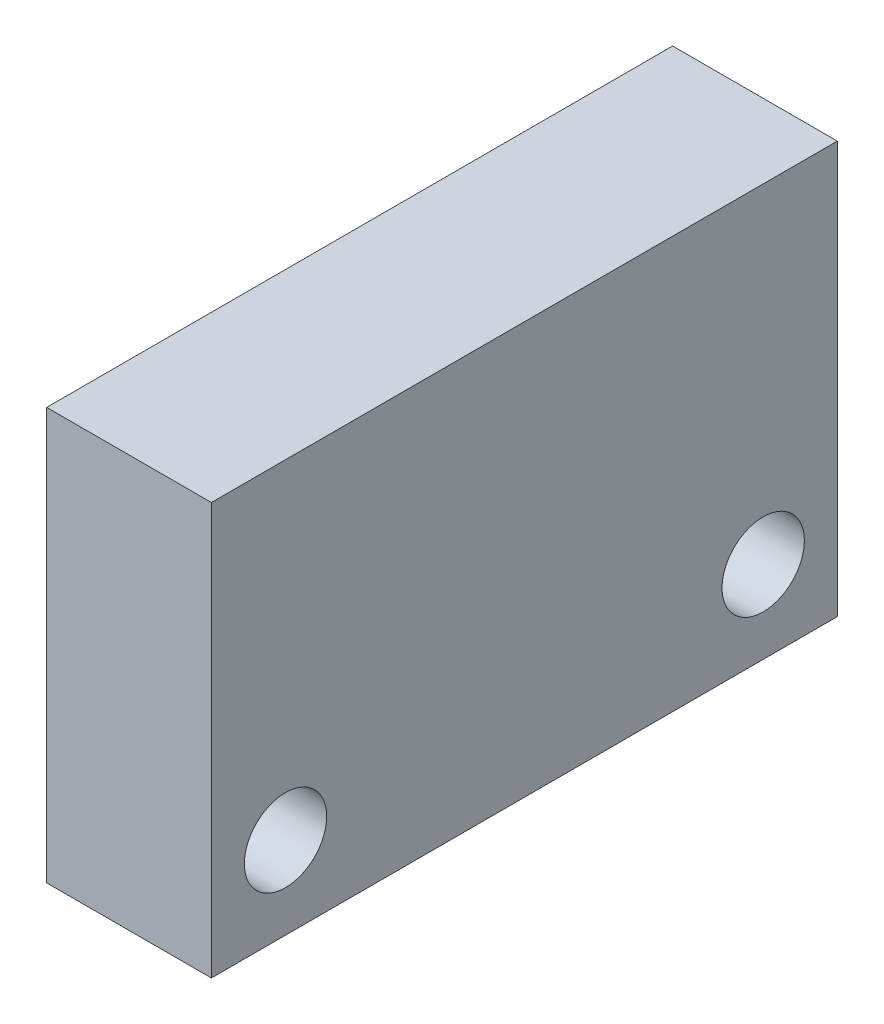
ISO-10303-21;
HEADER;
FILE_DESCRIPTION(('STEP AP214'),'2;1');
FILE_NAME('part.step','',(''),(''),'','','');
FILE_SCHEMA(('AUTOMOTIVE_DESIGN { 1 0 10303 214 1 1 1 1 }'));
ENDSEC;
DATA;
#1=APPLICATION_CONTEXT('core data for automotive mechanical design processes');
#2=APPLICATION_PROTOCOL_DEFINITION('international standard','automotive_design',2000,#1);
#3=PRODUCT_CONTEXT('',#1,'mechanical');
#4=PRODUCT('Part','Part','',(#3));
#5=PRODUCT_RELATED_PRODUCT_CATEGORY('part','',(#4));
#6=PRODUCT_DEFINITION_FORMATION('','',#4);
#7=PRODUCT_DEFINITION_CONTEXT('part definition',#1,'design');
#8=PRODUCT_DEFINITION('design','',#6,#7);
#9=PRODUCT_DEFINITION_SHAPE('','',#8);
#10=(LENGTH_UNIT() NAMED_UNIT(*) SI_UNIT(.MILLI.,.METRE.));
#11=(NAMED_UNIT(*) PLANE_ANGLE_UNIT() SI_UNIT($,.RADIAN.));
#12=(NAMED_UNIT(*) SI_UNIT($,.STERADIAN.) SOLID_ANGLE_UNIT());
#13=UNCERTAINTY_MEASURE_WITH_UNIT(LENGTH_MEASURE(1.E-05),#10,'distance_accuracy_value','');
#14=(GEOMETRIC_REPRESENTATION_CONTEXT(3) GLOBAL_UNCERTAINTY_ASSIGNED_CONTEXT((#13)) GLOBAL_UNIT_ASSIGNED_CONTEXT((#10,
#11,#12)) REPRESENTATION_CONTEXT('',''));
#15=CARTESIAN_POINT('',(0.,0.,0.));
#16=DIRECTION('',(0.,0.,1.));
#17=DIRECTION('',(1.,0.,0.));
#18=AXIS2_PLACEMENT_3D('',#15,#16,#17);
#19=CARTESIAN_POINT('',(-10.,50.,-38.));
#20=DIRECTION('',(1.,0.,0.));
#21=DIRECTION('',(0.,0.,-1.));
#22=AXIS2_PLACEMENT_3D('',#19,#20,#21);
#23=PLANE('',#22);
#24=DIRECTION('',(0.,0.,1.));
#25=VECTOR('',#24,1.);
#26=CARTESIAN_POINT('',(-10.,0.,-38.));
#27=LINE('',#26,#25);
#28=CARTESIAN_POINT('',(-10.,0.,-38.));
#29=VERTEX_POINT('',#28);
#30=CARTESIAN_POINT('',(-9.99999999999999,0.,38.));
#31=VERTEX_POINT('',#30);
#32=EDGE_CURVE('E108',#29,#31,#27,.T.);
#33=ORIENTED_EDGE('',*,*,#32,.T.);
#34=DIRECTION('',(0.,-1.,0.));
#35=VECTOR('',#34,1.);
#36=CARTESIAN_POINT('',(-9.99999999999999,50.,38.));
#37=LINE('',#36,#35);
#38=CARTESIAN_POINT('',(-9.99999999999999,50.,38.));
#39=VERTEX_POINT('',#38);
#40=EDGE_CURVE('E12',#39,#31,#37,.T.);
#41=ORIENTED_EDGE('',*,*,#40,.F.);
#42=DIRECTION('',(0.,0.,1.));
#43=VECTOR('',#42,1.);
#44=CARTESIAN_POINT('',(-10.,50.,-38.));
#45=LINE('',#44,#43);
#46=CARTESIAN_POINT('',(-10.,50.,-38.));
#47=VERTEX_POINT('',#46);
#48=EDGE_CURVE('E96',#47,#39,#45,.T.);
#49=ORIENTED_EDGE('',*,*,#48,.F.);
#50=DIRECTION('',(0.,-1.,0.));
#51=VECTOR('',#50,1.);
#52=CARTESIAN_POINT('',(-10.,50.,-38.));
#53=LINE('',#52,#51);
#54=EDGE_CURVE('E104',#47,#29,#53,.T.);
#55=ORIENTED_EDGE('',*,*,#54,.T.);
#56=EDGE_LOOP('',(#33,#41,#49,#55));
#57=FACE_BOUND('',#56,.T.);
#58=CARTESIAN_POINT('',(-10.,10.,-29.));
#59=DIRECTION('',(1.,0.,0.));
#60=DIRECTION('',(0.,0.,-1.));
#61=AXIS2_PLACEMENT_3D('',#58,#59,#60);
#62=CIRCLE('',#61,4.99999999999999);
#63=CARTESIAN_POINT('',(-10.,10.,-34.));
#64=VERTEX_POINT('',#63);
#65=EDGE_CURVE('E124',#64,#64,#62,.F.);
#66=ORIENTED_EDGE('',*,*,#65,.F.);
#67=EDGE_LOOP('',(#66));
#68=FACE_BOUND('',#67,.T.);
#69=CARTESIAN_POINT('',(-10.,10.,29.));
#70=DIRECTION('',(1.,0.,0.));
#71=DIRECTION('',(0.,0.,-1.));
#72=AXIS2_PLACEMENT_3D('',#69,#70,#71);
#73=CIRCLE('',#72,5.);
#74=CARTESIAN_POINT('',(-10.,10.,24.));
#75=VERTEX_POINT('',#74);
#76=EDGE_CURVE('E115',#75,#75,#73,.T.);
#77=ORIENTED_EDGE('',*,*,#76,.T.);
#78=EDGE_LOOP('',(#77));
#79=FACE_BOUND('',#78,.T.);
#80=ADVANCED_FACE('F44',(#57,#68,#79),#23,.F.);
#81=CARTESIAN_POINT('',(10.,50.,-38.));
#82=DIRECTION('',(-1.,0.,0.));
#83=DIRECTION('',(0.,0.,1.));
#84=AXIS2_PLACEMENT_3D('',#81,#82,#83);
#85=PLANE('',#84);
#86=DIRECTION('',(0.,0.,-1.));
#87=VECTOR('',#86,1.);
#88=CARTESIAN_POINT('',(10.,0.,-38.));
#89=LINE('',#88,#87);
#90=CARTESIAN_POINT('',(10.,0.,38.));
#91=VERTEX_POINT('',#90);
#92=CARTESIAN_POINT('',(10.,0.,-38.));
#93=VERTEX_POINT('',#92);
#94=EDGE_CURVE('E77',#91,#93,#89,.T.);
#95=ORIENTED_EDGE('',*,*,#94,.T.);
#96=DIRECTION('',(0.,-1.,0.));
#97=VECTOR('',#96,1.);
#98=CARTESIAN_POINT('',(10.,50.,-38.));
#99=LINE('',#98,#97);
#100=CARTESIAN_POINT('',(10.,50.,-38.));
#101=VERTEX_POINT('',#100);
#102=EDGE_CURVE('E101',#101,#93,#99,.T.);
#103=ORIENTED_EDGE('',*,*,#102,.F.);
#104=DIRECTION('',(0.,0.,-1.));
#105=VECTOR('',#104,1.);
#106=CARTESIAN_POINT('',(10.,50.,-38.));
#107=LINE('',#106,#105);
#108=CARTESIAN_POINT('',(10.,50.,38.));
#109=VERTEX_POINT('',#108);
#110=EDGE_CURVE('E94',#109,#101,#107,.T.);
#111=ORIENTED_EDGE('',*,*,#110,.F.);
#112=DIRECTION('',(0.,-1.,0.));
#113=VECTOR('',#112,1.);
#114=CARTESIAN_POINT('',(10.,50.,38.));
#115=LINE('',#114,#113);
#116=EDGE_CURVE('E52',#109,#91,#115,.T.);
#117=ORIENTED_EDGE('',*,*,#116,.T.);
#118=EDGE_LOOP('',(#95,#103,#111,#117));
#119=FACE_BOUND('',#118,.T.);
#120=CARTESIAN_POINT('',(10.,10.,-29.));
#121=DIRECTION('',(1.,0.,0.));
#122=DIRECTION('',(0.,0.,-1.));
#123=AXIS2_PLACEMENT_3D('',#120,#121,#122);
#124=CIRCLE('',#123,4.99999999999999);
#125=CARTESIAN_POINT('',(10.,10.,-34.));
#126=VERTEX_POINT('',#125);
#127=EDGE_CURVE('E130',#126,#126,#124,.F.);
#128=ORIENTED_EDGE('',*,*,#127,.T.);
#129=EDGE_LOOP('',(#128));
#130=FACE_BOUND('',#129,.T.);
#131=CARTESIAN_POINT('',(10.,10.,29.));
#132=DIRECTION('',(1.,0.,0.));
#133=DIRECTION('',(0.,0.,-1.));
#134=AXIS2_PLACEMENT_3D('',#131,#132,#133);
#135=CIRCLE('',#134,5.);
#136=CARTESIAN_POINT('',(10.,10.,24.));
#137=VERTEX_POINT('',#136);
#138=EDGE_CURVE('E128',#137,#137,#135,.T.);
#139=ORIENTED_EDGE('',*,*,#138,.F.);
#140=EDGE_LOOP('',(#139));
#141=FACE_BOUND('',#140,.T.);
#142=ADVANCED_FACE('F105',(#119,#130,#141),#85,.F.);
#143=CARTESIAN_POINT('',(10.,50.,38.));
#144=DIRECTION('',(0.,0.,-1.));
#145=DIRECTION('',(-1.,0.,0.));
#146=AXIS2_PLACEMENT_3D('',#143,#144,#145);
#147=PLANE('',#146);
#148=DIRECTION('',(1.,0.,0.));
#149=VECTOR('',#148,1.);
#150=CARTESIAN_POINT('',(10.,0.,38.));
#151=LINE('',#150,#149);
#152=EDGE_CURVE('E99',#31,#91,#151,.T.);
#153=ORIENTED_EDGE('',*,*,#152,.T.);
#154=ORIENTED_EDGE('',*,*,#116,.F.);
#155=DIRECTION('',(1.,0.,0.));
#156=VECTOR('',#155,1.);
#157=CARTESIAN_POINT('',(10.,50.,38.));
#158=LINE('',#157,#156);
#159=EDGE_CURVE('E93',#39,#109,#158,.T.);
#160=ORIENTED_EDGE('',*,*,#159,.F.);
#161=ORIENTED_EDGE('',*,*,#40,.T.);
#162=EDGE_LOOP('',(#153,#154,#160,#161));
#163=FACE_BOUND('',#162,.T.);
#164=ADVANCED_FACE('F97',(#163),#147,.F.);
#165=CARTESIAN_POINT('',(10.,50.,-38.));
#166=DIRECTION('',(0.,0.,1.));
#167=DIRECTION('',(1.,0.,0.));
#168=AXIS2_PLACEMENT_3D('',#165,#166,#167);
#169=PLANE('',#168);
#170=DIRECTION('',(-1.,0.,0.));
#171=VECTOR('',#170,1.);
#172=CARTESIAN_POINT('',(10.,0.,-38.));
#173=LINE('',#172,#171);
#174=EDGE_CURVE('E84',#93,#29,#173,.T.);
#175=ORIENTED_EDGE('',*,*,#174,.T.);
#176=ORIENTED_EDGE('',*,*,#54,.F.);
#177=DIRECTION('',(-1.,0.,0.));
#178=VECTOR('',#177,1.);
#179=CARTESIAN_POINT('',(10.,50.,-38.));
#180=LINE('',#179,#178);
#181=EDGE_CURVE('E61',#101,#47,#180,.T.);
#182=ORIENTED_EDGE('',*,*,#181,.F.);
#183=ORIENTED_EDGE('',*,*,#102,.T.);
#184=EDGE_LOOP('',(#175,#176,#182,#183));
#185=FACE_BOUND('',#184,.T.);
#186=ADVANCED_FACE('F120',(#185),#169,.F.);
#187=CARTESIAN_POINT('',(0.,50.,0.));
#188=DIRECTION('',(0.,-1.,0.));
#189=DIRECTION('',(0.,0.,-1.));
#190=AXIS2_PLACEMENT_3D('',#187,#188,#189);
#191=PLANE('',#190);
#192=ORIENTED_EDGE('',*,*,#48,.T.);
#193=ORIENTED_EDGE('',*,*,#159,.T.);
#194=ORIENTED_EDGE('',*,*,#110,.T.);
#195=ORIENTED_EDGE('',*,*,#181,.T.);
#196=EDGE_LOOP('',(#192,#193,#194,#195));
#197=FACE_BOUND('',#196,.T.);
#198=ADVANCED_FACE('F95',(#197),#191,.F.);
#199=CARTESIAN_POINT('',(0.,0.,0.));
#200=DIRECTION('',(0.,-1.,0.));
#201=DIRECTION('',(0.,0.,-1.));
#202=AXIS2_PLACEMENT_3D('',#199,#200,#201);
#203=PLANE('',#202);
#204=ORIENTED_EDGE('',*,*,#32,.F.);
#205=ORIENTED_EDGE('',*,*,#174,.F.);
#206=ORIENTED_EDGE('',*,*,#94,.F.);
#207=ORIENTED_EDGE('',*,*,#152,.F.);
#208=EDGE_LOOP('',(#204,#205,#206,#207));
#209=FACE_BOUND('',#208,.T.);
#210=ADVANCED_FACE('F119',(#209),#203,.T.);
#211=CARTESIAN_POINT('',(-10.,10.,-29.));
#212=DIRECTION('',(1.,0.,0.));
#213=DIRECTION('',(0.,0.,-1.));
#214=AXIS2_PLACEMENT_3D('',#211,#212,#213);
#215=CYLINDRICAL_SURFACE('',#214,4.99999999999999);
#216=ORIENTED_EDGE('',*,*,#65,.T.);
#217=EDGE_LOOP('',(#216));
#218=FACE_BOUND('',#217,.T.);
#219=ORIENTED_EDGE('',*,*,#127,.F.);
#220=EDGE_LOOP('',(#219));
#221=FACE_BOUND('',#220,.T.);
#222=ADVANCED_FACE('F136',(#218,#221),#215,.F.);
#223=CARTESIAN_POINT('',(-10.,10.,29.));
#224=DIRECTION('',(1.,0.,0.));
#225=DIRECTION('',(0.,0.,-1.));
#226=AXIS2_PLACEMENT_3D('',#223,#224,#225);
#227=CYLINDRICAL_SURFACE('',#226,5.);
#228=ORIENTED_EDGE('',*,*,#76,.F.);
#229=EDGE_LOOP('',(#228));
#230=FACE_BOUND('',#229,.T.);
#231=ORIENTED_EDGE('',*,*,#138,.T.);
#232=EDGE_LOOP('',(#231));
#233=FACE_BOUND('',#232,.T.);
#234=ADVANCED_FACE('F140',(#230,#233),#227,.F.);
#235=CLOSED_SHELL('',(#80,#142,#164,#186,#198,#210,#222,#234));
#236=MANIFOLD_SOLID_BREP('B2',#235);
#237=ADVANCED_BREP_SHAPE_REPRESENTATION('',(#18,#236),#14);
#238=SHAPE_DEFINITION_REPRESENTATION(#9,#237);
ENDSEC;
END-ISO-10303-21;
